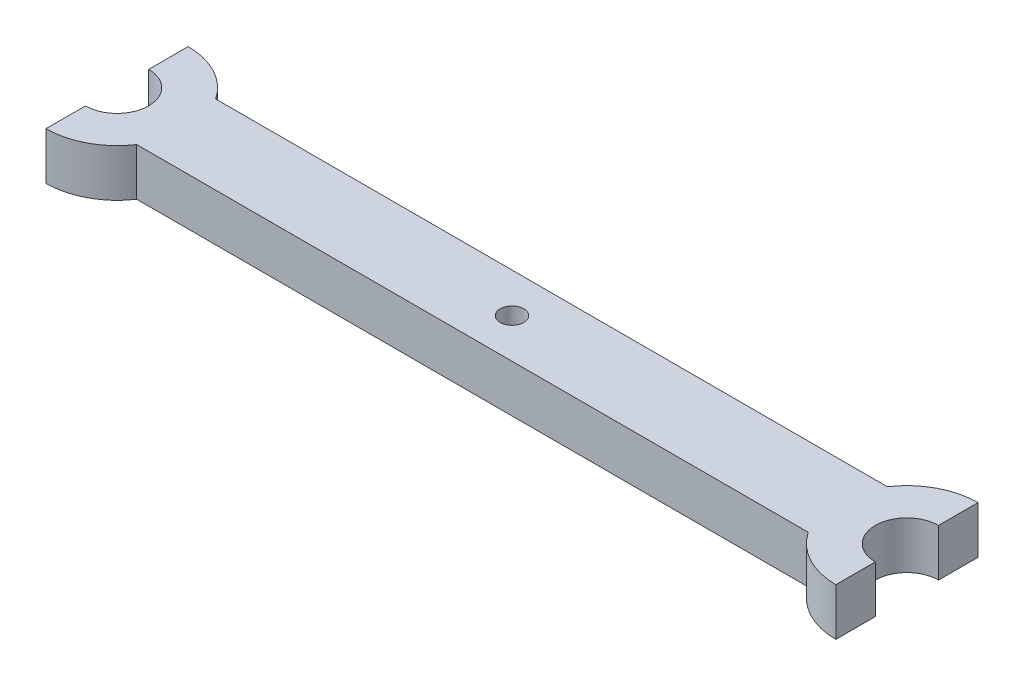
ISO-10303-21;
HEADER;
FILE_DESCRIPTION(('STEP AP214'),'2;1');
FILE_NAME('part.step','',(''),(''),'','','');
FILE_SCHEMA(('AUTOMOTIVE_DESIGN { 1 0 10303 214 1 1 1 1 }'));
ENDSEC;
DATA;
#1=APPLICATION_CONTEXT('core data for automotive mechanical design processes');
#2=APPLICATION_PROTOCOL_DEFINITION('international standard','automotive_design',2000,#1);
#3=PRODUCT_CONTEXT('',#1,'mechanical');
#4=PRODUCT('Part','Part','',(#3));
#5=PRODUCT_RELATED_PRODUCT_CATEGORY('part','',(#4));
#6=PRODUCT_DEFINITION_FORMATION('','',#4);
#7=PRODUCT_DEFINITION_CONTEXT('part definition',#1,'design');
#8=PRODUCT_DEFINITION('design','',#6,#7);
#9=PRODUCT_DEFINITION_SHAPE('','',#8);
#10=(LENGTH_UNIT() NAMED_UNIT(*) SI_UNIT(.MILLI.,.METRE.));
#11=(NAMED_UNIT(*) PLANE_ANGLE_UNIT() SI_UNIT($,.RADIAN.));
#12=(NAMED_UNIT(*) SI_UNIT($,.STERADIAN.) SOLID_ANGLE_UNIT());
#13=UNCERTAINTY_MEASURE_WITH_UNIT(LENGTH_MEASURE(1.E-05),#10,'distance_accuracy_value','');
#14=(GEOMETRIC_REPRESENTATION_CONTEXT(3) GLOBAL_UNCERTAINTY_ASSIGNED_CONTEXT((#13)) GLOBAL_UNIT_ASSIGNED_CONTEXT((#10,
#11,#12)) REPRESENTATION_CONTEXT('',''));
#15=CARTESIAN_POINT('',(0.,0.,0.));
#16=DIRECTION('',(0.,0.,1.));
#17=DIRECTION('',(1.,0.,0.));
#18=AXIS2_PLACEMENT_3D('',#15,#16,#17);
#19=CARTESIAN_POINT('',(-50.,6.,0.));
#20=DIRECTION('',(0.,-1.,0.));
#21=DIRECTION('',(0.,0.,-1.));
#22=AXIS2_PLACEMENT_3D('',#19,#20,#21);
#23=CYLINDRICAL_SURFACE('',#22,4.);
#24=CARTESIAN_POINT('',(-50.,0.,0.));
#25=DIRECTION('',(0.,-1.,0.));
#26=DIRECTION('',(0.,0.,1.));
#27=AXIS2_PLACEMENT_3D('',#24,#25,#26);
#28=CIRCLE('',#27,4.);
#29=CARTESIAN_POINT('',(-50.,0.,-4.));
#30=VERTEX_POINT('',#29);
#31=CARTESIAN_POINT('',(-50.,0.,4.));
#32=VERTEX_POINT('',#31);
#33=EDGE_CURVE('E155',#30,#32,#28,.T.);
#34=ORIENTED_EDGE('',*,*,#33,.T.);
#35=DIRECTION('',(0.,-1.,0.));
#36=VECTOR('',#35,1.);
#37=CARTESIAN_POINT('',(-50.,6.,4.));
#38=LINE('',#37,#36);
#39=CARTESIAN_POINT('',(-50.,6.,4.));
#40=VERTEX_POINT('',#39);
#41=EDGE_CURVE('E11',#40,#32,#38,.T.);
#42=ORIENTED_EDGE('',*,*,#41,.F.);
#43=CARTESIAN_POINT('',(-50.,6.,0.));
#44=DIRECTION('',(0.,-1.,0.));
#45=DIRECTION('',(0.,0.,1.));
#46=AXIS2_PLACEMENT_3D('',#43,#44,#45);
#47=CIRCLE('',#46,4.);
#48=CARTESIAN_POINT('',(-50.,6.,-4.));
#49=VERTEX_POINT('',#48);
#50=EDGE_CURVE('E178',#49,#40,#47,.T.);
#51=ORIENTED_EDGE('',*,*,#50,.F.);
#52=DIRECTION('',(0.,-1.,0.));
#53=VECTOR('',#52,1.);
#54=CARTESIAN_POINT('',(-50.,6.,-4.));
#55=LINE('',#54,#53);
#56=EDGE_CURVE('E151',#49,#30,#55,.T.);
#57=ORIENTED_EDGE('',*,*,#56,.T.);
#58=EDGE_LOOP('',(#34,#42,#51,#57));
#59=FACE_BOUND('',#58,.T.);
#60=ADVANCED_FACE('F35',(#59),#23,.F.);
#61=CARTESIAN_POINT('',(-50.,6.,4.));
#62=DIRECTION('',(1.,0.,0.));
#63=DIRECTION('',(0.,0.,-1.));
#64=AXIS2_PLACEMENT_3D('',#61,#62,#63);
#65=PLANE('',#64);
#66=DIRECTION('',(0.,0.,1.));
#67=VECTOR('',#66,1.);
#68=CARTESIAN_POINT('',(-50.,0.,4.));
#69=LINE('',#68,#67);
#70=CARTESIAN_POINT('',(-50.,0.,9.));
#71=VERTEX_POINT('',#70);
#72=EDGE_CURVE('E158',#32,#71,#69,.T.);
#73=ORIENTED_EDGE('',*,*,#72,.T.);
#74=DIRECTION('',(0.,-1.,0.));
#75=VECTOR('',#74,1.);
#76=CARTESIAN_POINT('',(-50.,6.,9.));
#77=LINE('',#76,#75);
#78=CARTESIAN_POINT('',(-50.,6.,9.));
#79=VERTEX_POINT('',#78);
#80=EDGE_CURVE('E43',#79,#71,#77,.T.);
#81=ORIENTED_EDGE('',*,*,#80,.F.);
#82=DIRECTION('',(0.,0.,1.));
#83=VECTOR('',#82,1.);
#84=CARTESIAN_POINT('',(-50.,6.,4.));
#85=LINE('',#84,#83);
#86=EDGE_CURVE('E106',#40,#79,#85,.T.);
#87=ORIENTED_EDGE('',*,*,#86,.F.);
#88=ORIENTED_EDGE('',*,*,#41,.T.);
#89=EDGE_LOOP('',(#73,#81,#87,#88));
#90=FACE_BOUND('',#89,.T.);
#91=ADVANCED_FACE('F257',(#90),#65,.F.);
#92=CARTESIAN_POINT('',(-50.,6.,0.));
#93=DIRECTION('',(0.,-1.,0.));
#94=DIRECTION('',(0.,0.,-1.));
#95=AXIS2_PLACEMENT_3D('',#92,#93,#94);
#96=CYLINDRICAL_SURFACE('',#95,9.);
#97=CARTESIAN_POINT('',(-50.,0.,0.));
#98=DIRECTION('',(0.,1.,0.));
#99=DIRECTION('',(0.,0.,1.));
#100=AXIS2_PLACEMENT_3D('',#97,#98,#99);
#101=CIRCLE('',#100,9.);
#102=CARTESIAN_POINT('',(-42.5166852264521,0.,5.));
#103=VERTEX_POINT('',#102);
#104=EDGE_CURVE('E161',#71,#103,#101,.T.);
#105=ORIENTED_EDGE('',*,*,#104,.T.);
#106=DIRECTION('',(0.,-1.,0.));
#107=VECTOR('',#106,1.);
#108=CARTESIAN_POINT('',(-42.5166852264521,6.,5.));
#109=LINE('',#108,#107);
#110=CARTESIAN_POINT('',(-42.5166852264521,6.,5.));
#111=VERTEX_POINT('',#110);
#112=EDGE_CURVE('E197',#111,#103,#109,.T.);
#113=ORIENTED_EDGE('',*,*,#112,.F.);
#114=CARTESIAN_POINT('',(-50.,6.,0.));
#115=DIRECTION('',(0.,1.,0.));
#116=DIRECTION('',(0.,0.,1.));
#117=AXIS2_PLACEMENT_3D('',#114,#115,#116);
#118=CIRCLE('',#117,9.);
#119=EDGE_CURVE('E205',#79,#111,#118,.T.);
#120=ORIENTED_EDGE('',*,*,#119,.F.);
#121=ORIENTED_EDGE('',*,*,#80,.T.);
#122=EDGE_LOOP('',(#105,#113,#120,#121));
#123=FACE_BOUND('',#122,.T.);
#124=ADVANCED_FACE('F203',(#123),#96,.T.);
#125=CARTESIAN_POINT('',(-42.5166852264521,6.,5.));
#126=DIRECTION('',(0.,0.,-1.));
#127=DIRECTION('',(-1.,0.,0.));
#128=AXIS2_PLACEMENT_3D('',#125,#126,#127);
#129=PLANE('',#128);
#130=DIRECTION('',(1.,0.,0.));
#131=VECTOR('',#130,1.);
#132=CARTESIAN_POINT('',(-42.5166852264521,0.,5.));
#133=LINE('',#132,#131);
#134=CARTESIAN_POINT('',(42.5166852264521,0.,5.));
#135=VERTEX_POINT('',#134);
#136=EDGE_CURVE('E163',#103,#135,#133,.T.);
#137=ORIENTED_EDGE('',*,*,#136,.T.);
#138=DIRECTION('',(0.,-1.,0.));
#139=VECTOR('',#138,1.);
#140=CARTESIAN_POINT('',(42.5166852264521,6.,5.));
#141=LINE('',#140,#139);
#142=CARTESIAN_POINT('',(42.5166852264521,6.,5.));
#143=VERTEX_POINT('',#142);
#144=EDGE_CURVE('E194',#143,#135,#141,.T.);
#145=ORIENTED_EDGE('',*,*,#144,.F.);
#146=DIRECTION('',(1.,0.,0.));
#147=VECTOR('',#146,1.);
#148=CARTESIAN_POINT('',(-42.5166852264521,6.,5.));
#149=LINE('',#148,#147);
#150=EDGE_CURVE('E223',#111,#143,#149,.T.);
#151=ORIENTED_EDGE('',*,*,#150,.F.);
#152=ORIENTED_EDGE('',*,*,#112,.T.);
#153=EDGE_LOOP('',(#137,#145,#151,#152));
#154=FACE_BOUND('',#153,.T.);
#155=ADVANCED_FACE('F214',(#154),#129,.F.);
#156=CARTESIAN_POINT('',(50.,6.,0.));
#157=DIRECTION('',(0.,-1.,0.));
#158=DIRECTION('',(0.,0.,-1.));
#159=AXIS2_PLACEMENT_3D('',#156,#157,#158);
#160=CYLINDRICAL_SURFACE('',#159,9.);
#161=CARTESIAN_POINT('',(50.,0.,0.));
#162=DIRECTION('',(0.,1.,0.));
#163=DIRECTION('',(0.,0.,-1.));
#164=AXIS2_PLACEMENT_3D('',#161,#162,#163);
#165=CIRCLE('',#164,9.);
#166=CARTESIAN_POINT('',(50.,0.,9.));
#167=VERTEX_POINT('',#166);
#168=EDGE_CURVE('E165',#135,#167,#165,.T.);
#169=ORIENTED_EDGE('',*,*,#168,.T.);
#170=DIRECTION('',(0.,-1.,0.));
#171=VECTOR('',#170,1.);
#172=CARTESIAN_POINT('',(50.,6.,9.));
#173=LINE('',#172,#171);
#174=CARTESIAN_POINT('',(50.,6.,9.));
#175=VERTEX_POINT('',#174);
#176=EDGE_CURVE('E191',#175,#167,#173,.T.);
#177=ORIENTED_EDGE('',*,*,#176,.F.);
#178=CARTESIAN_POINT('',(50.,6.,0.));
#179=DIRECTION('',(0.,1.,0.));
#180=DIRECTION('',(0.,0.,-1.));
#181=AXIS2_PLACEMENT_3D('',#178,#179,#180);
#182=CIRCLE('',#181,9.);
#183=EDGE_CURVE('E220',#143,#175,#182,.T.);
#184=ORIENTED_EDGE('',*,*,#183,.F.);
#185=ORIENTED_EDGE('',*,*,#144,.T.);
#186=EDGE_LOOP('',(#169,#177,#184,#185));
#187=FACE_BOUND('',#186,.T.);
#188=ADVANCED_FACE('F218',(#187),#160,.T.);
#189=CARTESIAN_POINT('',(50.,6.,4.));
#190=DIRECTION('',(-1.,0.,0.));
#191=DIRECTION('',(0.,0.,1.));
#192=AXIS2_PLACEMENT_3D('',#189,#190,#191);
#193=PLANE('',#192);
#194=DIRECTION('',(0.,0.,-1.));
#195=VECTOR('',#194,1.);
#196=CARTESIAN_POINT('',(50.,0.,4.));
#197=LINE('',#196,#195);
#198=CARTESIAN_POINT('',(50.,0.,4.));
#199=VERTEX_POINT('',#198);
#200=EDGE_CURVE('E167',#167,#199,#197,.T.);
#201=ORIENTED_EDGE('',*,*,#200,.T.);
#202=DIRECTION('',(0.,-1.,0.));
#203=VECTOR('',#202,1.);
#204=CARTESIAN_POINT('',(50.,6.,4.));
#205=LINE('',#204,#203);
#206=CARTESIAN_POINT('',(50.,6.,4.));
#207=VERTEX_POINT('',#206);
#208=EDGE_CURVE('E188',#207,#199,#205,.T.);
#209=ORIENTED_EDGE('',*,*,#208,.F.);
#210=DIRECTION('',(0.,0.,-1.));
#211=VECTOR('',#210,1.);
#212=CARTESIAN_POINT('',(50.,6.,4.));
#213=LINE('',#212,#211);
#214=EDGE_CURVE('E222',#175,#207,#213,.T.);
#215=ORIENTED_EDGE('',*,*,#214,.F.);
#216=ORIENTED_EDGE('',*,*,#176,.T.);
#217=EDGE_LOOP('',(#201,#209,#215,#216));
#218=FACE_BOUND('',#217,.T.);
#219=ADVANCED_FACE('F270',(#218),#193,.F.);
#220=CARTESIAN_POINT('',(50.,6.,0.));
#221=DIRECTION('',(0.,-1.,0.));
#222=DIRECTION('',(0.,0.,-1.));
#223=AXIS2_PLACEMENT_3D('',#220,#221,#222);
#224=CYLINDRICAL_SURFACE('',#223,4.);
#225=CARTESIAN_POINT('',(50.,0.,0.));
#226=DIRECTION('',(0.,-1.,0.));
#227=DIRECTION('',(0.,0.,1.));
#228=AXIS2_PLACEMENT_3D('',#225,#226,#227);
#229=CIRCLE('',#228,4.);
#230=CARTESIAN_POINT('',(50.,0.,-4.));
#231=VERTEX_POINT('',#230);
#232=EDGE_CURVE('E169',#199,#231,#229,.T.);
#233=ORIENTED_EDGE('',*,*,#232,.T.);
#234=DIRECTION('',(0.,-1.,0.));
#235=VECTOR('',#234,1.);
#236=CARTESIAN_POINT('',(50.,6.,-4.));
#237=LINE('',#236,#235);
#238=CARTESIAN_POINT('',(50.,6.,-4.));
#239=VERTEX_POINT('',#238);
#240=EDGE_CURVE('E185',#239,#231,#237,.T.);
#241=ORIENTED_EDGE('',*,*,#240,.F.);
#242=CARTESIAN_POINT('',(50.,6.,0.));
#243=DIRECTION('',(0.,-1.,0.));
#244=DIRECTION('',(0.,0.,1.));
#245=AXIS2_PLACEMENT_3D('',#242,#243,#244);
#246=CIRCLE('',#245,4.);
#247=EDGE_CURVE('E225',#207,#239,#246,.T.);
#248=ORIENTED_EDGE('',*,*,#247,.F.);
#249=ORIENTED_EDGE('',*,*,#208,.T.);
#250=EDGE_LOOP('',(#233,#241,#248,#249));
#251=FACE_BOUND('',#250,.T.);
#252=ADVANCED_FACE('F273',(#251),#224,.F.);
#253=CARTESIAN_POINT('',(50.,6.,-4.));
#254=DIRECTION('',(-1.,0.,0.));
#255=DIRECTION('',(0.,0.,1.));
#256=AXIS2_PLACEMENT_3D('',#253,#254,#255);
#257=PLANE('',#256);
#258=DIRECTION('',(0.,0.,-1.));
#259=VECTOR('',#258,1.);
#260=CARTESIAN_POINT('',(50.,0.,-4.));
#261=LINE('',#260,#259);
#262=CARTESIAN_POINT('',(50.,0.,-9.));
#263=VERTEX_POINT('',#262);
#264=EDGE_CURVE('E171',#231,#263,#261,.T.);
#265=ORIENTED_EDGE('',*,*,#264,.T.);
#266=DIRECTION('',(0.,-1.,0.));
#267=VECTOR('',#266,1.);
#268=CARTESIAN_POINT('',(50.,6.,-9.));
#269=LINE('',#268,#267);
#270=CARTESIAN_POINT('',(50.,6.,-9.));
#271=VERTEX_POINT('',#270);
#272=EDGE_CURVE('E182',#271,#263,#269,.T.);
#273=ORIENTED_EDGE('',*,*,#272,.F.);
#274=DIRECTION('',(0.,0.,-1.));
#275=VECTOR('',#274,1.);
#276=CARTESIAN_POINT('',(50.,6.,-4.));
#277=LINE('',#276,#275);
#278=EDGE_CURVE('E231',#239,#271,#277,.T.);
#279=ORIENTED_EDGE('',*,*,#278,.F.);
#280=ORIENTED_EDGE('',*,*,#240,.T.);
#281=EDGE_LOOP('',(#265,#273,#279,#280));
#282=FACE_BOUND('',#281,.T.);
#283=ADVANCED_FACE('F237',(#282),#257,.F.);
#284=CARTESIAN_POINT('',(50.,6.,0.));
#285=DIRECTION('',(0.,-1.,0.));
#286=DIRECTION('',(0.,0.,-1.));
#287=AXIS2_PLACEMENT_3D('',#284,#285,#286);
#288=CYLINDRICAL_SURFACE('',#287,9.);
#289=CARTESIAN_POINT('',(50.,0.,0.));
#290=DIRECTION('',(0.,1.,0.));
#291=DIRECTION('',(0.,0.,1.));
#292=AXIS2_PLACEMENT_3D('',#289,#290,#291);
#293=CIRCLE('',#292,9.);
#294=CARTESIAN_POINT('',(42.5166852264521,0.,-5.));
#295=VERTEX_POINT('',#294);
#296=EDGE_CURVE('E173',#263,#295,#293,.T.);
#297=ORIENTED_EDGE('',*,*,#296,.T.);
#298=DIRECTION('',(0.,-1.,0.));
#299=VECTOR('',#298,1.);
#300=CARTESIAN_POINT('',(42.5166852264521,6.,-5.));
#301=LINE('',#300,#299);
#302=CARTESIAN_POINT('',(42.5166852264521,6.,-5.));
#303=VERTEX_POINT('',#302);
#304=EDGE_CURVE('E146',#303,#295,#301,.T.);
#305=ORIENTED_EDGE('',*,*,#304,.F.);
#306=CARTESIAN_POINT('',(50.,6.,0.));
#307=DIRECTION('',(0.,1.,0.));
#308=DIRECTION('',(0.,0.,1.));
#309=AXIS2_PLACEMENT_3D('',#306,#307,#308);
#310=CIRCLE('',#309,9.);
#311=EDGE_CURVE('E137',#271,#303,#310,.T.);
#312=ORIENTED_EDGE('',*,*,#311,.F.);
#313=ORIENTED_EDGE('',*,*,#272,.T.);
#314=EDGE_LOOP('',(#297,#305,#312,#313));
#315=FACE_BOUND('',#314,.T.);
#316=ADVANCED_FACE('F241',(#315),#288,.T.);
#317=CARTESIAN_POINT('',(-42.5166852264521,6.,-5.));
#318=DIRECTION('',(0.,0.,1.));
#319=DIRECTION('',(1.,0.,0.));
#320=AXIS2_PLACEMENT_3D('',#317,#318,#319);
#321=PLANE('',#320);
#322=DIRECTION('',(-1.,0.,0.));
#323=VECTOR('',#322,1.);
#324=CARTESIAN_POINT('',(-42.5166852264521,0.,-5.));
#325=LINE('',#324,#323);
#326=CARTESIAN_POINT('',(-42.5166852264521,0.,-5.));
#327=VERTEX_POINT('',#326);
#328=EDGE_CURVE('E145',#295,#327,#325,.T.);
#329=ORIENTED_EDGE('',*,*,#328,.T.);
#330=DIRECTION('',(0.,-1.,0.));
#331=VECTOR('',#330,1.);
#332=CARTESIAN_POINT('',(-42.5166852264521,6.,-5.));
#333=LINE('',#332,#331);
#334=CARTESIAN_POINT('',(-42.5166852264521,6.,-5.));
#335=VERTEX_POINT('',#334);
#336=EDGE_CURVE('E142',#335,#327,#333,.T.);
#337=ORIENTED_EDGE('',*,*,#336,.F.);
#338=DIRECTION('',(-1.,0.,0.));
#339=VECTOR('',#338,1.);
#340=CARTESIAN_POINT('',(-42.5166852264521,6.,-5.));
#341=LINE('',#340,#339);
#342=EDGE_CURVE('E131',#303,#335,#341,.T.);
#343=ORIENTED_EDGE('',*,*,#342,.F.);
#344=ORIENTED_EDGE('',*,*,#304,.T.);
#345=EDGE_LOOP('',(#329,#337,#343,#344));
#346=FACE_BOUND('',#345,.T.);
#347=ADVANCED_FACE('F143',(#346),#321,.F.);
#348=CARTESIAN_POINT('',(-50.,6.,0.));
#349=DIRECTION('',(0.,-1.,0.));
#350=DIRECTION('',(0.,0.,-1.));
#351=AXIS2_PLACEMENT_3D('',#348,#349,#350);
#352=CYLINDRICAL_SURFACE('',#351,9.);
#353=CARTESIAN_POINT('',(-50.,0.,0.));
#354=DIRECTION('',(0.,1.,0.));
#355=DIRECTION('',(0.,0.,-1.));
#356=AXIS2_PLACEMENT_3D('',#353,#354,#355);
#357=CIRCLE('',#356,9.);
#358=CARTESIAN_POINT('',(-50.,0.,-9.));
#359=VERTEX_POINT('',#358);
#360=EDGE_CURVE('E92',#327,#359,#357,.T.);
#361=ORIENTED_EDGE('',*,*,#360,.T.);
#362=DIRECTION('',(0.,-1.,0.));
#363=VECTOR('',#362,1.);
#364=CARTESIAN_POINT('',(-50.,6.,-9.));
#365=LINE('',#364,#363);
#366=CARTESIAN_POINT('',(-50.,6.,-9.));
#367=VERTEX_POINT('',#366);
#368=EDGE_CURVE('E147',#367,#359,#365,.T.);
#369=ORIENTED_EDGE('',*,*,#368,.F.);
#370=CARTESIAN_POINT('',(-50.,6.,0.));
#371=DIRECTION('',(0.,1.,0.));
#372=DIRECTION('',(0.,0.,-1.));
#373=AXIS2_PLACEMENT_3D('',#370,#371,#372);
#374=CIRCLE('',#373,9.);
#375=EDGE_CURVE('E135',#335,#367,#374,.T.);
#376=ORIENTED_EDGE('',*,*,#375,.F.);
#377=ORIENTED_EDGE('',*,*,#336,.T.);
#378=EDGE_LOOP('',(#361,#369,#376,#377));
#379=FACE_BOUND('',#378,.T.);
#380=ADVANCED_FACE('F149',(#379),#352,.T.);
#381=CARTESIAN_POINT('',(-50.,6.,-4.));
#382=DIRECTION('',(1.,0.,0.));
#383=DIRECTION('',(0.,0.,-1.));
#384=AXIS2_PLACEMENT_3D('',#381,#382,#383);
#385=PLANE('',#384);
#386=DIRECTION('',(0.,0.,1.));
#387=VECTOR('',#386,1.);
#388=CARTESIAN_POINT('',(-50.,0.,-4.));
#389=LINE('',#388,#387);
#390=EDGE_CURVE('E98',#359,#30,#389,.T.);
#391=ORIENTED_EDGE('',*,*,#390,.T.);
#392=ORIENTED_EDGE('',*,*,#56,.F.);
#393=DIRECTION('',(0.,0.,1.));
#394=VECTOR('',#393,1.);
#395=CARTESIAN_POINT('',(-50.,6.,-4.));
#396=LINE('',#395,#394);
#397=EDGE_CURVE('E51',#367,#49,#396,.T.);
#398=ORIENTED_EDGE('',*,*,#397,.F.);
#399=ORIENTED_EDGE('',*,*,#368,.T.);
#400=EDGE_LOOP('',(#391,#392,#398,#399));
#401=FACE_BOUND('',#400,.T.);
#402=ADVANCED_FACE('F245',(#401),#385,.F.);
#403=CARTESIAN_POINT('',(-50.,6.,0.));
#404=DIRECTION('',(0.,1.,0.));
#405=DIRECTION('',(0.,0.,1.));
#406=AXIS2_PLACEMENT_3D('',#403,#404,#405);
#407=PLANE('',#406);
#408=CARTESIAN_POINT('',(0.,6.,0.));
#409=DIRECTION('',(0.,1.,0.));
#410=DIRECTION('',(0.,0.,1.));
#411=AXIS2_PLACEMENT_3D('',#408,#409,#410);
#412=CIRCLE('',#411,1.5);
#413=CARTESIAN_POINT('',(0.,6.,1.5));
#414=VERTEX_POINT('',#413);
#415=EDGE_CURVE('E328',#414,#414,#412,.T.);
#416=ORIENTED_EDGE('',*,*,#415,.F.);
#417=EDGE_LOOP('',(#416));
#418=FACE_BOUND('',#417,.T.);
#419=ORIENTED_EDGE('',*,*,#50,.T.);
#420=ORIENTED_EDGE('',*,*,#86,.T.);
#421=ORIENTED_EDGE('',*,*,#119,.T.);
#422=ORIENTED_EDGE('',*,*,#150,.T.);
#423=ORIENTED_EDGE('',*,*,#183,.T.);
#424=ORIENTED_EDGE('',*,*,#214,.T.);
#425=ORIENTED_EDGE('',*,*,#247,.T.);
#426=ORIENTED_EDGE('',*,*,#278,.T.);
#427=ORIENTED_EDGE('',*,*,#311,.T.);
#428=ORIENTED_EDGE('',*,*,#342,.T.);
#429=ORIENTED_EDGE('',*,*,#375,.T.);
#430=ORIENTED_EDGE('',*,*,#397,.T.);
#431=EDGE_LOOP('',(#419,#420,#421,#422,#423,#424,#425,#426,#427,#428,#429,#430));
#432=FACE_BOUND('',#431,.T.);
#433=ADVANCED_FACE('F133',(#418,#432),#407,.T.);
#434=CARTESIAN_POINT('',(-50.,0.,0.));
#435=DIRECTION('',(0.,1.,0.));
#436=DIRECTION('',(0.,0.,1.));
#437=AXIS2_PLACEMENT_3D('',#434,#435,#436);
#438=PLANE('',#437);
#439=CARTESIAN_POINT('',(0.,0.,0.));
#440=DIRECTION('',(0.,1.,0.));
#441=DIRECTION('',(0.,0.,1.));
#442=AXIS2_PLACEMENT_3D('',#439,#440,#441);
#443=CIRCLE('',#442,1.5);
#444=CARTESIAN_POINT('',(0.,0.,1.5));
#445=VERTEX_POINT('',#444);
#446=EDGE_CURVE('E159',#445,#445,#443,.T.);
#447=ORIENTED_EDGE('',*,*,#446,.T.);
#448=EDGE_LOOP('',(#447));
#449=FACE_BOUND('',#448,.T.);
#450=ORIENTED_EDGE('',*,*,#33,.F.);
#451=ORIENTED_EDGE('',*,*,#390,.F.);
#452=ORIENTED_EDGE('',*,*,#360,.F.);
#453=ORIENTED_EDGE('',*,*,#328,.F.);
#454=ORIENTED_EDGE('',*,*,#296,.F.);
#455=ORIENTED_EDGE('',*,*,#264,.F.);
#456=ORIENTED_EDGE('',*,*,#232,.F.);
#457=ORIENTED_EDGE('',*,*,#200,.F.);
#458=ORIENTED_EDGE('',*,*,#168,.F.);
#459=ORIENTED_EDGE('',*,*,#136,.F.);
#460=ORIENTED_EDGE('',*,*,#104,.F.);
#461=ORIENTED_EDGE('',*,*,#72,.F.);
#462=EDGE_LOOP('',(#450,#451,#452,#453,#454,#455,#456,#457,#458,#459,#460,#461));
#463=FACE_BOUND('',#462,.T.);
#464=ADVANCED_FACE('F209',(#449,#463),#438,.F.);
#465=CARTESIAN_POINT('',(0.,0.,0.));
#466=DIRECTION('',(0.,1.,0.));
#467=DIRECTION('',(0.,0.,1.));
#468=AXIS2_PLACEMENT_3D('',#465,#466,#467);
#469=CYLINDRICAL_SURFACE('',#468,1.5);
#470=ORIENTED_EDGE('',*,*,#446,.F.);
#471=EDGE_LOOP('',(#470));
#472=FACE_BOUND('',#471,.T.);
#473=ORIENTED_EDGE('',*,*,#415,.T.);
#474=EDGE_LOOP('',(#473));
#475=FACE_BOUND('',#474,.T.);
#476=ADVANCED_FACE('F310',(#472,#475),#469,.F.);
#477=CLOSED_SHELL('',(#60,#91,#124,#155,#188,#219,#252,#283,#316,#347,#380,#402,#433,#464,#476));
#478=MANIFOLD_SOLID_BREP('B2',#477);
#479=ADVANCED_BREP_SHAPE_REPRESENTATION('',(#18,#478),#14);
#480=SHAPE_DEFINITION_REPRESENTATION(#9,#479);
ENDSEC;
END-ISO-10303-21;
